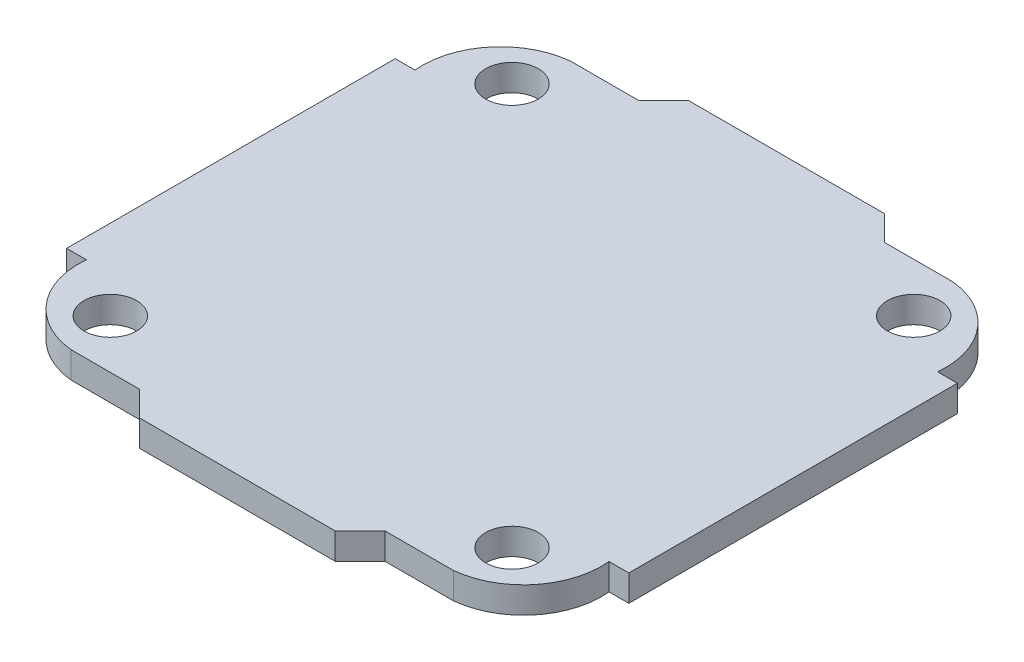
ISO-10303-21;
HEADER;
FILE_DESCRIPTION(('STEP AP214'),'2;1');
FILE_NAME('part.step','',(''),(''),'','','');
FILE_SCHEMA(('AUTOMOTIVE_DESIGN { 1 0 10303 214 1 1 1 1 }'));
ENDSEC;
DATA;
#1=APPLICATION_CONTEXT('core data for automotive mechanical design processes');
#2=APPLICATION_PROTOCOL_DEFINITION('international standard','automotive_design',2000,#1);
#3=PRODUCT_CONTEXT('',#1,'mechanical');
#4=PRODUCT('Part','Part','',(#3));
#5=PRODUCT_RELATED_PRODUCT_CATEGORY('part','',(#4));
#6=PRODUCT_DEFINITION_FORMATION('','',#4);
#7=PRODUCT_DEFINITION_CONTEXT('part definition',#1,'design');
#8=PRODUCT_DEFINITION('design','',#6,#7);
#9=PRODUCT_DEFINITION_SHAPE('','',#8);
#10=(LENGTH_UNIT() NAMED_UNIT(*) SI_UNIT(.MILLI.,.METRE.));
#11=(NAMED_UNIT(*) PLANE_ANGLE_UNIT() SI_UNIT($,.RADIAN.));
#12=(NAMED_UNIT(*) SI_UNIT($,.STERADIAN.) SOLID_ANGLE_UNIT());
#13=UNCERTAINTY_MEASURE_WITH_UNIT(LENGTH_MEASURE(1.E-05),#10,'distance_accuracy_value','');
#14=(GEOMETRIC_REPRESENTATION_CONTEXT(3) GLOBAL_UNCERTAINTY_ASSIGNED_CONTEXT((#13)) GLOBAL_UNIT_ASSIGNED_CONTEXT((#10,
#11,#12)) REPRESENTATION_CONTEXT('',''));
#15=CARTESIAN_POINT('',(0.,0.,0.));
#16=DIRECTION('',(0.,0.,1.));
#17=DIRECTION('',(1.,0.,0.));
#18=AXIS2_PLACEMENT_3D('',#15,#16,#17);
#19=CARTESIAN_POINT('',(0.,2.,0.));
#20=DIRECTION('',(0.,1.,0.));
#21=DIRECTION('',(0.,0.,1.));
#22=AXIS2_PLACEMENT_3D('',#19,#20,#21);
#23=PLANE('',#22);
#24=DIRECTION('',(-0.707106781186546,0.,-0.707106781186549));
#25=VECTOR('',#24,1.);
#26=CARTESIAN_POINT('',(-9.31312532764978,2.,18.9681853553326));
#27=LINE('',#26,#25);
#28=CARTESIAN_POINT('',(-7.42392500251573,2.,20.8573856804667));
#29=VERTEX_POINT('',#28);
#30=CARTESIAN_POINT('',(-9.31312532764978,2.,18.9681853553326));
#31=VERTEX_POINT('',#30);
#32=EDGE_CURVE('E332',#29,#31,#27,.T.);
#33=ORIENTED_EDGE('',*,*,#32,.F.);
#34=DIRECTION('',(1.,0.,0.));
#35=VECTOR('',#34,1.);
#36=CARTESIAN_POINT('',(-19.8872747185846,2.,20.8573856804667));
#37=LINE('',#36,#35);
#38=CARTESIAN_POINT('',(7.42392500251573,2.,20.8573856804667));
#39=VERTEX_POINT('',#38);
#40=EDGE_CURVE('E214',#29,#39,#37,.T.);
#41=ORIENTED_EDGE('',*,*,#40,.T.);
#42=DIRECTION('',(-0.707106781186546,0.,0.707106781186549));
#43=VECTOR('',#42,1.);
#44=CARTESIAN_POINT('',(9.31312532764978,2.,18.9681853553326));
#45=LINE('',#44,#43);
#46=CARTESIAN_POINT('',(9.31312532764978,2.,18.9681853553326));
#47=VERTEX_POINT('',#46);
#48=EDGE_CURVE('E380',#47,#39,#45,.T.);
#49=ORIENTED_EDGE('',*,*,#48,.F.);
#50=DIRECTION('',(-1.,0.,0.));
#51=VECTOR('',#50,1.);
#52=CARTESIAN_POINT('',(14.5122677443801,2.,18.9681853553326));
#53=LINE('',#52,#51);
#54=CARTESIAN_POINT('',(14.5122677443801,2.,18.9681853553326));
#55=VERTEX_POINT('',#54);
#56=EDGE_CURVE('E193',#55,#47,#53,.T.);
#57=ORIENTED_EDGE('',*,*,#56,.F.);
#58=CARTESIAN_POINT('',(13.9304142609193,2.,13.0558031846826));
#59=DIRECTION('',(0.,-1.,0.));
#60=DIRECTION('',(0.,0.,-1.));
#61=AXIS2_PLACEMENT_3D('',#58,#59,#60);
#62=CIRCLE('',#61,5.94094406706841);
#63=CARTESIAN_POINT('',(19.8427964315693,2.,12.4739497012219));
#64=VERTEX_POINT('',#63);
#65=EDGE_CURVE('E365',#64,#55,#62,.T.);
#66=ORIENTED_EDGE('',*,*,#65,.F.);
#67=DIRECTION('',(-1.,0.,0.));
#68=VECTOR('',#67,1.);
#69=CARTESIAN_POINT('',(19.8427964315693,2.,12.4739497012219));
#70=LINE('',#69,#68);
#71=CARTESIAN_POINT('',(21.3424411614078,2.,12.4739497012219));
#72=VERTEX_POINT('',#71);
#73=EDGE_CURVE('E383',#72,#64,#70,.T.);
#74=ORIENTED_EDGE('',*,*,#73,.F.);
#75=DIRECTION('',(0.,0.,-1.));
#76=VECTOR('',#75,1.);
#77=CARTESIAN_POINT('',(21.3424411614078,2.,19.4022192376435));
#78=LINE('',#77,#76);
#79=CARTESIAN_POINT('',(21.3424411614078,2.,-12.4739497012219));
#80=VERTEX_POINT('',#79);
#81=EDGE_CURVE('E210',#72,#80,#78,.T.);
#82=ORIENTED_EDGE('',*,*,#81,.T.);
#83=DIRECTION('',(1.,0.,0.));
#84=VECTOR('',#83,1.);
#85=CARTESIAN_POINT('',(19.8427964315693,2.,-12.4739497012219));
#86=LINE('',#85,#84);
#87=CARTESIAN_POINT('',(19.8427964315693,2.,-12.4739497012219));
#88=VERTEX_POINT('',#87);
#89=EDGE_CURVE('E406',#88,#80,#86,.T.);
#90=ORIENTED_EDGE('',*,*,#89,.F.);
#91=CARTESIAN_POINT('',(13.9304142609193,2.,-13.0558031846826));
#92=DIRECTION('',(0.,-1.,0.));
#93=DIRECTION('',(0.,0.,1.));
#94=AXIS2_PLACEMENT_3D('',#91,#92,#93);
#95=CIRCLE('',#94,5.94094406706841);
#96=CARTESIAN_POINT('',(14.5122677443801,2.,-18.9681853553326));
#97=VERTEX_POINT('',#96);
#98=EDGE_CURVE('E422',#97,#88,#95,.T.);
#99=ORIENTED_EDGE('',*,*,#98,.F.);
#100=DIRECTION('',(1.,0.,0.));
#101=VECTOR('',#100,1.);
#102=CARTESIAN_POINT('',(14.5122677443801,2.,-18.9681853553326));
#103=LINE('',#102,#101);
#104=CARTESIAN_POINT('',(9.31312532764978,2.,-18.9681853553326));
#105=VERTEX_POINT('',#104);
#106=EDGE_CURVE('E202',#105,#97,#103,.T.);
#107=ORIENTED_EDGE('',*,*,#106,.F.);
#108=DIRECTION('',(0.707106781186546,0.,0.707106781186549));
#109=VECTOR('',#108,1.);
#110=CARTESIAN_POINT('',(9.31312532764978,2.,-18.9681853553326));
#111=LINE('',#110,#109);
#112=CARTESIAN_POINT('',(7.42392500251573,2.,-20.8573856804667));
#113=VERTEX_POINT('',#112);
#114=EDGE_CURVE('E185',#113,#105,#111,.T.);
#115=ORIENTED_EDGE('',*,*,#114,.F.);
#116=DIRECTION('',(-1.,0.,0.));
#117=VECTOR('',#116,1.);
#118=CARTESIAN_POINT('',(19.8872747185845,2.,-20.8573856804667));
#119=LINE('',#118,#117);
#120=CARTESIAN_POINT('',(-7.42392500251573,2.,-20.8573856804667));
#121=VERTEX_POINT('',#120);
#122=EDGE_CURVE('E54',#113,#121,#119,.T.);
#123=ORIENTED_EDGE('',*,*,#122,.T.);
#124=DIRECTION('',(0.707106781186546,0.,-0.707106781186549));
#125=VECTOR('',#124,1.);
#126=CARTESIAN_POINT('',(-9.31312532764978,2.,-18.9681853553326));
#127=LINE('',#126,#125);
#128=CARTESIAN_POINT('',(-9.31312532764978,2.,-18.9681853553326));
#129=VERTEX_POINT('',#128);
#130=EDGE_CURVE('E290',#129,#121,#127,.T.);
#131=ORIENTED_EDGE('',*,*,#130,.F.);
#132=DIRECTION('',(1.,0.,0.));
#133=VECTOR('',#132,1.);
#134=CARTESIAN_POINT('',(-14.5122677443801,2.,-18.9681853553326));
#135=LINE('',#134,#133);
#136=CARTESIAN_POINT('',(-14.5122677443801,2.,-18.9681853553326));
#137=VERTEX_POINT('',#136);
#138=EDGE_CURVE('E293',#137,#129,#135,.T.);
#139=ORIENTED_EDGE('',*,*,#138,.F.);
#140=CARTESIAN_POINT('',(-13.9304142609193,2.,-13.0558031846826));
#141=DIRECTION('',(0.,-1.,0.));
#142=DIRECTION('',(0.,0.,-1.));
#143=AXIS2_PLACEMENT_3D('',#140,#141,#142);
#144=CIRCLE('',#143,5.94094406706841);
#145=CARTESIAN_POINT('',(-19.8427964315693,2.,-12.4739497012219));
#146=VERTEX_POINT('',#145);
#147=EDGE_CURVE('E204',#146,#137,#144,.T.);
#148=ORIENTED_EDGE('',*,*,#147,.F.);
#149=DIRECTION('',(1.,0.,0.));
#150=VECTOR('',#149,1.);
#151=CARTESIAN_POINT('',(-19.8427964315693,2.,-12.4739497012219));
#152=LINE('',#151,#150);
#153=CARTESIAN_POINT('',(-21.3424411614078,2.,-12.4739497012219));
#154=VERTEX_POINT('',#153);
#155=EDGE_CURVE('E285',#154,#146,#152,.T.);
#156=ORIENTED_EDGE('',*,*,#155,.F.);
#157=DIRECTION('',(0.,0.,1.));
#158=VECTOR('',#157,1.);
#159=CARTESIAN_POINT('',(-21.3424411614078,2.,-19.4022192376435));
#160=LINE('',#159,#158);
#161=CARTESIAN_POINT('',(-21.3424411614078,2.,12.4739497012219));
#162=VERTEX_POINT('',#161);
#163=EDGE_CURVE('E11',#154,#162,#160,.T.);
#164=ORIENTED_EDGE('',*,*,#163,.T.);
#165=DIRECTION('',(-1.,0.,0.));
#166=VECTOR('',#165,1.);
#167=CARTESIAN_POINT('',(-19.8427964315693,2.,12.4739497012219));
#168=LINE('',#167,#166);
#169=CARTESIAN_POINT('',(-19.8427964315693,2.,12.4739497012219));
#170=VERTEX_POINT('',#169);
#171=EDGE_CURVE('E318',#170,#162,#168,.T.);
#172=ORIENTED_EDGE('',*,*,#171,.F.);
#173=CARTESIAN_POINT('',(-13.9304142609193,2.,13.0558031846826));
#174=DIRECTION('',(0.,-1.,0.));
#175=DIRECTION('',(0.,0.,1.));
#176=AXIS2_PLACEMENT_3D('',#173,#174,#175);
#177=CIRCLE('',#176,5.94094406706841);
#178=CARTESIAN_POINT('',(-14.5122677443801,2.,18.9681853553326));
#179=VERTEX_POINT('',#178);
#180=EDGE_CURVE('E341',#179,#170,#177,.T.);
#181=ORIENTED_EDGE('',*,*,#180,.F.);
#182=DIRECTION('',(-1.,0.,0.));
#183=VECTOR('',#182,1.);
#184=CARTESIAN_POINT('',(-14.5122677443801,2.,18.9681853553326));
#185=LINE('',#184,#183);
#186=EDGE_CURVE('E337',#31,#179,#185,.T.);
#187=ORIENTED_EDGE('',*,*,#186,.F.);
#188=EDGE_LOOP('',(#33,#41,#49,#57,#66,#74,#82,#90,#99,#107,#115,#123,#131,#139,#148,#156,#164,
#172,#181,#187));
#189=FACE_BOUND('',#188,.T.);
#190=CARTESIAN_POINT('',(15.25,2.,15.25));
#191=DIRECTION('',(0.,1.,0.));
#192=DIRECTION('',(0.,0.,-1.));
#193=AXIS2_PLACEMENT_3D('',#190,#191,#192);
#194=CIRCLE('',#193,2.);
#195=CARTESIAN_POINT('',(15.25,2.,13.25));
#196=VERTEX_POINT('',#195);
#197=EDGE_CURVE('E251',#196,#196,#194,.T.);
#198=ORIENTED_EDGE('',*,*,#197,.F.);
#199=EDGE_LOOP('',(#198));
#200=FACE_BOUND('',#199,.T.);
#201=CARTESIAN_POINT('',(15.25,2.,-15.25));
#202=DIRECTION('',(0.,1.,0.));
#203=DIRECTION('',(0.,0.,1.));
#204=AXIS2_PLACEMENT_3D('',#201,#202,#203);
#205=CIRCLE('',#204,2.);
#206=CARTESIAN_POINT('',(15.25,2.,-13.25));
#207=VERTEX_POINT('',#206);
#208=EDGE_CURVE('E223',#207,#207,#205,.T.);
#209=ORIENTED_EDGE('',*,*,#208,.F.);
#210=EDGE_LOOP('',(#209));
#211=FACE_BOUND('',#210,.T.);
#212=CARTESIAN_POINT('',(-15.25,2.,-15.25));
#213=DIRECTION('',(0.,1.,0.));
#214=DIRECTION('',(0.,0.,-1.));
#215=AXIS2_PLACEMENT_3D('',#212,#213,#214);
#216=CIRCLE('',#215,2.);
#217=CARTESIAN_POINT('',(-15.25,2.,-17.25));
#218=VERTEX_POINT('',#217);
#219=EDGE_CURVE('E243',#218,#218,#216,.T.);
#220=ORIENTED_EDGE('',*,*,#219,.F.);
#221=EDGE_LOOP('',(#220));
#222=FACE_BOUND('',#221,.T.);
#223=CARTESIAN_POINT('',(-15.25,2.,15.25));
#224=DIRECTION('',(0.,1.,0.));
#225=DIRECTION('',(0.,0.,1.));
#226=AXIS2_PLACEMENT_3D('',#223,#224,#225);
#227=CIRCLE('',#226,2.);
#228=CARTESIAN_POINT('',(-15.25,2.,17.25));
#229=VERTEX_POINT('',#228);
#230=EDGE_CURVE('E259',#229,#229,#227,.T.);
#231=ORIENTED_EDGE('',*,*,#230,.F.);
#232=EDGE_LOOP('',(#231));
#233=FACE_BOUND('',#232,.T.);
#234=ADVANCED_FACE('F44',(#189,#200,#211,#222,#233),#23,.T.);
#235=CARTESIAN_POINT('',(0.,0.,0.));
#236=DIRECTION('',(0.,1.,0.));
#237=DIRECTION('',(0.,0.,1.));
#238=AXIS2_PLACEMENT_3D('',#235,#236,#237);
#239=PLANE('',#238);
#240=DIRECTION('',(1.,0.,0.));
#241=VECTOR('',#240,1.);
#242=CARTESIAN_POINT('',(-19.8872747185846,0.,20.8573856804667));
#243=LINE('',#242,#241);
#244=CARTESIAN_POINT('',(-7.42392500251573,0.,20.8573856804667));
#245=VERTEX_POINT('',#244);
#246=CARTESIAN_POINT('',(7.42392500251573,0.,20.8573856804667));
#247=VERTEX_POINT('',#246);
#248=EDGE_CURVE('E218',#245,#247,#243,.T.);
#249=ORIENTED_EDGE('',*,*,#248,.F.);
#250=DIRECTION('',(-0.707106781186546,0.,-0.707106781186549));
#251=VECTOR('',#250,1.);
#252=CARTESIAN_POINT('',(-9.31312532764978,0.,18.9681853553326));
#253=LINE('',#252,#251);
#254=CARTESIAN_POINT('',(-9.31312532764978,0.,18.9681853553326));
#255=VERTEX_POINT('',#254);
#256=EDGE_CURVE('E314',#245,#255,#253,.T.);
#257=ORIENTED_EDGE('',*,*,#256,.T.);
#258=DIRECTION('',(-1.,0.,0.));
#259=VECTOR('',#258,1.);
#260=CARTESIAN_POINT('',(-14.5122677443801,0.,18.9681853553326));
#261=LINE('',#260,#259);
#262=CARTESIAN_POINT('',(-14.5122677443801,0.,18.9681853553326));
#263=VERTEX_POINT('',#262);
#264=EDGE_CURVE('E319',#255,#263,#261,.T.);
#265=ORIENTED_EDGE('',*,*,#264,.T.);
#266=CARTESIAN_POINT('',(-13.9304142609193,0.,13.0558031846826));
#267=DIRECTION('',(0.,-1.,0.));
#268=DIRECTION('',(0.,0.,1.));
#269=AXIS2_PLACEMENT_3D('',#266,#267,#268);
#270=CIRCLE('',#269,5.94094406706841);
#271=CARTESIAN_POINT('',(-19.8427964315693,0.,12.4739497012219));
#272=VERTEX_POINT('',#271);
#273=EDGE_CURVE('E323',#263,#272,#270,.T.);
#274=ORIENTED_EDGE('',*,*,#273,.T.);
#275=DIRECTION('',(-1.,0.,0.));
#276=VECTOR('',#275,1.);
#277=CARTESIAN_POINT('',(-19.8427964315693,0.,12.4739497012219));
#278=LINE('',#277,#276);
#279=CARTESIAN_POINT('',(-21.3424411614078,0.,12.4739497012219));
#280=VERTEX_POINT('',#279);
#281=EDGE_CURVE('E327',#272,#280,#278,.T.);
#282=ORIENTED_EDGE('',*,*,#281,.T.);
#283=DIRECTION('',(0.,0.,1.));
#284=VECTOR('',#283,1.);
#285=CARTESIAN_POINT('',(-21.3424411614078,0.,-19.4022192376435));
#286=LINE('',#285,#284);
#287=CARTESIAN_POINT('',(-21.3424411614078,0.,-12.4739497012219));
#288=VERTEX_POINT('',#287);
#289=EDGE_CURVE('E48',#288,#280,#286,.T.);
#290=ORIENTED_EDGE('',*,*,#289,.F.);
#291=DIRECTION('',(1.,0.,0.));
#292=VECTOR('',#291,1.);
#293=CARTESIAN_POINT('',(-19.8427964315693,0.,-12.4739497012219));
#294=LINE('',#293,#292);
#295=CARTESIAN_POINT('',(-19.8427964315693,0.,-12.4739497012219));
#296=VERTEX_POINT('',#295);
#297=EDGE_CURVE('E275',#288,#296,#294,.T.);
#298=ORIENTED_EDGE('',*,*,#297,.T.);
#299=CARTESIAN_POINT('',(-13.9304142609193,0.,-13.0558031846826));
#300=DIRECTION('',(0.,-1.,0.));
#301=DIRECTION('',(0.,0.,-1.));
#302=AXIS2_PLACEMENT_3D('',#299,#300,#301);
#303=CIRCLE('',#302,5.94094406706841);
#304=CARTESIAN_POINT('',(-14.5122677443801,0.,-18.9681853553326));
#305=VERTEX_POINT('',#304);
#306=EDGE_CURVE('E289',#296,#305,#303,.T.);
#307=ORIENTED_EDGE('',*,*,#306,.T.);
#308=DIRECTION('',(1.,0.,0.));
#309=VECTOR('',#308,1.);
#310=CARTESIAN_POINT('',(-14.5122677443801,0.,-18.9681853553326));
#311=LINE('',#310,#309);
#312=CARTESIAN_POINT('',(-9.31312532764978,0.,-18.9681853553326));
#313=VERTEX_POINT('',#312);
#314=EDGE_CURVE('E307',#305,#313,#311,.T.);
#315=ORIENTED_EDGE('',*,*,#314,.T.);
#316=DIRECTION('',(0.707106781186546,0.,-0.707106781186549));
#317=VECTOR('',#316,1.);
#318=CARTESIAN_POINT('',(-9.31312532764978,0.,-18.9681853553326));
#319=LINE('',#318,#317);
#320=CARTESIAN_POINT('',(-7.42392500251573,0.,-20.8573856804667));
#321=VERTEX_POINT('',#320);
#322=EDGE_CURVE('E303',#313,#321,#319,.T.);
#323=ORIENTED_EDGE('',*,*,#322,.T.);
#324=DIRECTION('',(-1.,0.,0.));
#325=VECTOR('',#324,1.);
#326=CARTESIAN_POINT('',(19.8872747185845,0.,-20.8573856804667));
#327=LINE('',#326,#325);
#328=CARTESIAN_POINT('',(7.42392500251573,0.,-20.8573856804667));
#329=VERTEX_POINT('',#328);
#330=EDGE_CURVE('E226',#329,#321,#327,.T.);
#331=ORIENTED_EDGE('',*,*,#330,.F.);
#332=DIRECTION('',(0.707106781186546,0.,0.707106781186549));
#333=VECTOR('',#332,1.);
#334=CARTESIAN_POINT('',(9.31312532764978,0.,-18.9681853553326));
#335=LINE('',#334,#333);
#336=CARTESIAN_POINT('',(9.31312532764978,0.,-18.9681853553326));
#337=VERTEX_POINT('',#336);
#338=EDGE_CURVE('E70',#329,#337,#335,.T.);
#339=ORIENTED_EDGE('',*,*,#338,.T.);
#340=DIRECTION('',(1.,0.,0.));
#341=VECTOR('',#340,1.);
#342=CARTESIAN_POINT('',(14.5122677443801,0.,-18.9681853553326));
#343=LINE('',#342,#341);
#344=CARTESIAN_POINT('',(14.5122677443801,0.,-18.9681853553326));
#345=VERTEX_POINT('',#344);
#346=EDGE_CURVE('E407',#337,#345,#343,.T.);
#347=ORIENTED_EDGE('',*,*,#346,.T.);
#348=CARTESIAN_POINT('',(13.9304142609193,0.,-13.0558031846826));
#349=DIRECTION('',(0.,-1.,0.));
#350=DIRECTION('',(0.,0.,1.));
#351=AXIS2_PLACEMENT_3D('',#348,#349,#350);
#352=CIRCLE('',#351,5.94094406706841);
#353=CARTESIAN_POINT('',(19.8427964315693,0.,-12.4739497012219));
#354=VERTEX_POINT('',#353);
#355=EDGE_CURVE('E411',#345,#354,#352,.T.);
#356=ORIENTED_EDGE('',*,*,#355,.T.);
#357=DIRECTION('',(1.,0.,0.));
#358=VECTOR('',#357,1.);
#359=CARTESIAN_POINT('',(19.8427964315693,0.,-12.4739497012219));
#360=LINE('',#359,#358);
#361=CARTESIAN_POINT('',(21.3424411614078,0.,-12.4739497012219));
#362=VERTEX_POINT('',#361);
#363=EDGE_CURVE('E415',#354,#362,#360,.T.);
#364=ORIENTED_EDGE('',*,*,#363,.T.);
#365=DIRECTION('',(0.,0.,-1.));
#366=VECTOR('',#365,1.);
#367=CARTESIAN_POINT('',(21.3424411614078,0.,19.4022192376435));
#368=LINE('',#367,#366);
#369=CARTESIAN_POINT('',(21.3424411614078,0.,12.4739497012219));
#370=VERTEX_POINT('',#369);
#371=EDGE_CURVE('E222',#370,#362,#368,.T.);
#372=ORIENTED_EDGE('',*,*,#371,.F.);
#373=DIRECTION('',(-1.,0.,0.));
#374=VECTOR('',#373,1.);
#375=CARTESIAN_POINT('',(19.8427964315693,0.,12.4739497012219));
#376=LINE('',#375,#374);
#377=CARTESIAN_POINT('',(19.8427964315693,0.,12.4739497012219));
#378=VERTEX_POINT('',#377);
#379=EDGE_CURVE('E62',#370,#378,#376,.T.);
#380=ORIENTED_EDGE('',*,*,#379,.T.);
#381=CARTESIAN_POINT('',(13.9304142609193,0.,13.0558031846826));
#382=DIRECTION('',(0.,-1.,0.));
#383=DIRECTION('',(0.,0.,-1.));
#384=AXIS2_PLACEMENT_3D('',#381,#382,#383);
#385=CIRCLE('',#384,5.94094406706841);
#386=CARTESIAN_POINT('',(14.5122677443801,0.,18.9681853553326));
#387=VERTEX_POINT('',#386);
#388=EDGE_CURVE('E372',#378,#387,#385,.T.);
#389=ORIENTED_EDGE('',*,*,#388,.T.);
#390=DIRECTION('',(-1.,0.,0.));
#391=VECTOR('',#390,1.);
#392=CARTESIAN_POINT('',(14.5122677443801,0.,18.9681853553326));
#393=LINE('',#392,#391);
#394=CARTESIAN_POINT('',(9.31312532764978,0.,18.9681853553326));
#395=VERTEX_POINT('',#394);
#396=EDGE_CURVE('E361',#387,#395,#393,.T.);
#397=ORIENTED_EDGE('',*,*,#396,.T.);
#398=DIRECTION('',(-0.707106781186546,0.,0.707106781186549));
#399=VECTOR('',#398,1.);
#400=CARTESIAN_POINT('',(9.31312532764978,0.,18.9681853553326));
#401=LINE('',#400,#399);
#402=EDGE_CURVE('E366',#395,#247,#401,.T.);
#403=ORIENTED_EDGE('',*,*,#402,.T.);
#404=EDGE_LOOP('',(#249,#257,#265,#274,#282,#290,#298,#307,#315,#323,#331,#339,#347,#356,#364,
#372,#380,#389,#397,#403));
#405=FACE_BOUND('',#404,.T.);
#406=CARTESIAN_POINT('',(15.25,0.,-15.25));
#407=DIRECTION('',(0.,1.,0.));
#408=DIRECTION('',(0.,0.,1.));
#409=AXIS2_PLACEMENT_3D('',#406,#407,#408);
#410=CIRCLE('',#409,2.);
#411=CARTESIAN_POINT('',(15.25,0.,-13.25));
#412=VERTEX_POINT('',#411);
#413=EDGE_CURVE('E239',#412,#412,#410,.T.);
#414=ORIENTED_EDGE('',*,*,#413,.T.);
#415=EDGE_LOOP('',(#414));
#416=FACE_BOUND('',#415,.T.);
#417=CARTESIAN_POINT('',(-15.25,0.,-15.25));
#418=DIRECTION('',(0.,1.,0.));
#419=DIRECTION('',(0.,0.,-1.));
#420=AXIS2_PLACEMENT_3D('',#417,#418,#419);
#421=CIRCLE('',#420,2.);
#422=CARTESIAN_POINT('',(-15.25,0.,-17.25));
#423=VERTEX_POINT('',#422);
#424=EDGE_CURVE('E247',#423,#423,#421,.T.);
#425=ORIENTED_EDGE('',*,*,#424,.T.);
#426=EDGE_LOOP('',(#425));
#427=FACE_BOUND('',#426,.T.);
#428=CARTESIAN_POINT('',(15.25,0.,15.25));
#429=DIRECTION('',(0.,1.,0.));
#430=DIRECTION('',(0.,0.,-1.));
#431=AXIS2_PLACEMENT_3D('',#428,#429,#430);
#432=CIRCLE('',#431,2.);
#433=CARTESIAN_POINT('',(15.25,0.,13.25));
#434=VERTEX_POINT('',#433);
#435=EDGE_CURVE('E255',#434,#434,#432,.T.);
#436=ORIENTED_EDGE('',*,*,#435,.T.);
#437=EDGE_LOOP('',(#436));
#438=FACE_BOUND('',#437,.T.);
#439=CARTESIAN_POINT('',(-15.25,0.,15.25));
#440=DIRECTION('',(0.,1.,0.));
#441=DIRECTION('',(0.,0.,1.));
#442=AXIS2_PLACEMENT_3D('',#439,#440,#441);
#443=CIRCLE('',#442,2.);
#444=CARTESIAN_POINT('',(-15.25,0.,17.25));
#445=VERTEX_POINT('',#444);
#446=EDGE_CURVE('E263',#445,#445,#443,.T.);
#447=ORIENTED_EDGE('',*,*,#446,.T.);
#448=EDGE_LOOP('',(#447));
#449=FACE_BOUND('',#448,.T.);
#450=ADVANCED_FACE('F444',(#405,#416,#427,#438,#449),#239,.F.);
#451=CARTESIAN_POINT('',(-19.8872747185846,2.,20.8573856804667));
#452=DIRECTION('',(0.,0.,-1.));
#453=DIRECTION('',(-1.,0.,0.));
#454=AXIS2_PLACEMENT_3D('',#451,#452,#453);
#455=PLANE('',#454);
#456=ORIENTED_EDGE('',*,*,#40,.F.);
#457=DIRECTION('',(0.,1.,0.));
#458=VECTOR('',#457,1.);
#459=CARTESIAN_POINT('',(-7.42392500251573,0.,20.8573856804667));
#460=LINE('',#459,#458);
#461=EDGE_CURVE('E347',#245,#29,#460,.T.);
#462=ORIENTED_EDGE('',*,*,#461,.F.);
#463=ORIENTED_EDGE('',*,*,#248,.T.);
#464=DIRECTION('',(0.,1.,0.));
#465=VECTOR('',#464,1.);
#466=CARTESIAN_POINT('',(7.42392500251573,0.,20.8573856804667));
#467=LINE('',#466,#465);
#468=EDGE_CURVE('E398',#247,#39,#467,.T.);
#469=ORIENTED_EDGE('',*,*,#468,.T.);
#470=EDGE_LOOP('',(#456,#462,#463,#469));
#471=FACE_BOUND('',#470,.T.);
#472=ADVANCED_FACE('F46',(#471),#455,.F.);
#473=CARTESIAN_POINT('',(21.3424411614078,2.,19.4022192376435));
#474=DIRECTION('',(-1.,0.,0.));
#475=DIRECTION('',(0.,0.,1.));
#476=AXIS2_PLACEMENT_3D('',#473,#474,#475);
#477=PLANE('',#476);
#478=ORIENTED_EDGE('',*,*,#81,.F.);
#479=DIRECTION('',(0.,1.,0.));
#480=VECTOR('',#479,1.);
#481=CARTESIAN_POINT('',(21.3424411614078,0.,12.4739497012219));
#482=LINE('',#481,#480);
#483=EDGE_CURVE('E395',#370,#72,#482,.T.);
#484=ORIENTED_EDGE('',*,*,#483,.F.);
#485=ORIENTED_EDGE('',*,*,#371,.T.);
#486=DIRECTION('',(0.,1.,0.));
#487=VECTOR('',#486,1.);
#488=CARTESIAN_POINT('',(21.3424411614078,0.,-12.4739497012219));
#489=LINE('',#488,#487);
#490=EDGE_CURVE('E192',#362,#80,#489,.T.);
#491=ORIENTED_EDGE('',*,*,#490,.T.);
#492=EDGE_LOOP('',(#478,#484,#485,#491));
#493=FACE_BOUND('',#492,.T.);
#494=ADVANCED_FACE('F494',(#493),#477,.F.);
#495=CARTESIAN_POINT('',(19.8872747185845,2.,-20.8573856804667));
#496=DIRECTION('',(0.,0.,1.));
#497=DIRECTION('',(1.,0.,0.));
#498=AXIS2_PLACEMENT_3D('',#495,#496,#497);
#499=PLANE('',#498);
#500=ORIENTED_EDGE('',*,*,#122,.F.);
#501=DIRECTION('',(0.,1.,0.));
#502=VECTOR('',#501,1.);
#503=CARTESIAN_POINT('',(7.42392500251573,0.,-20.8573856804667));
#504=LINE('',#503,#502);
#505=EDGE_CURVE('E182',#329,#113,#504,.T.);
#506=ORIENTED_EDGE('',*,*,#505,.F.);
#507=ORIENTED_EDGE('',*,*,#330,.T.);
#508=DIRECTION('',(0.,1.,0.));
#509=VECTOR('',#508,1.);
#510=CARTESIAN_POINT('',(-7.42392500251573,0.,-20.8573856804667));
#511=LINE('',#510,#509);
#512=EDGE_CURVE('E208',#321,#121,#511,.T.);
#513=ORIENTED_EDGE('',*,*,#512,.T.);
#514=EDGE_LOOP('',(#500,#506,#507,#513));
#515=FACE_BOUND('',#514,.T.);
#516=ADVANCED_FACE('F207',(#515),#499,.F.);
#517=CARTESIAN_POINT('',(-21.3424411614078,2.,-19.4022192376435));
#518=DIRECTION('',(1.,0.,0.));
#519=DIRECTION('',(0.,0.,-1.));
#520=AXIS2_PLACEMENT_3D('',#517,#518,#519);
#521=PLANE('',#520);
#522=ORIENTED_EDGE('',*,*,#289,.T.);
#523=DIRECTION('',(0.,1.,0.));
#524=VECTOR('',#523,1.);
#525=CARTESIAN_POINT('',(-21.3424411614078,0.,12.4739497012219));
#526=LINE('',#525,#524);
#527=EDGE_CURVE('E350',#280,#162,#526,.T.);
#528=ORIENTED_EDGE('',*,*,#527,.T.);
#529=ORIENTED_EDGE('',*,*,#163,.F.);
#530=DIRECTION('',(0.,1.,0.));
#531=VECTOR('',#530,1.);
#532=CARTESIAN_POINT('',(-21.3424411614078,0.,-12.4739497012219));
#533=LINE('',#532,#531);
#534=EDGE_CURVE('E280',#288,#154,#533,.T.);
#535=ORIENTED_EDGE('',*,*,#534,.F.);
#536=EDGE_LOOP('',(#522,#528,#529,#535));
#537=FACE_BOUND('',#536,.T.);
#538=ADVANCED_FACE('F462',(#537),#521,.F.);
#539=CARTESIAN_POINT('',(15.25,2.,-15.25));
#540=DIRECTION('',(0.,-1.,0.));
#541=DIRECTION('',(0.,0.,-1.));
#542=AXIS2_PLACEMENT_3D('',#539,#540,#541);
#543=CYLINDRICAL_SURFACE('',#542,2.);
#544=ORIENTED_EDGE('',*,*,#208,.T.);
#545=EDGE_LOOP('',(#544));
#546=FACE_BOUND('',#545,.T.);
#547=ORIENTED_EDGE('',*,*,#413,.F.);
#548=EDGE_LOOP('',(#547));
#549=FACE_BOUND('',#548,.T.);
#550=ADVANCED_FACE('F517',(#546,#549),#543,.F.);
#551=CARTESIAN_POINT('',(-15.25,2.,-15.25));
#552=DIRECTION('',(0.,-1.,0.));
#553=DIRECTION('',(0.,0.,-1.));
#554=AXIS2_PLACEMENT_3D('',#551,#552,#553);
#555=CYLINDRICAL_SURFACE('',#554,2.);
#556=ORIENTED_EDGE('',*,*,#219,.T.);
#557=EDGE_LOOP('',(#556));
#558=FACE_BOUND('',#557,.T.);
#559=ORIENTED_EDGE('',*,*,#424,.F.);
#560=EDGE_LOOP('',(#559));
#561=FACE_BOUND('',#560,.T.);
#562=ADVANCED_FACE('F562',(#558,#561),#555,.F.);
#563=CARTESIAN_POINT('',(15.25,2.,15.25));
#564=DIRECTION('',(0.,-1.,0.));
#565=DIRECTION('',(0.,0.,-1.));
#566=AXIS2_PLACEMENT_3D('',#563,#564,#565);
#567=CYLINDRICAL_SURFACE('',#566,2.);
#568=ORIENTED_EDGE('',*,*,#197,.T.);
#569=EDGE_LOOP('',(#568));
#570=FACE_BOUND('',#569,.T.);
#571=ORIENTED_EDGE('',*,*,#435,.F.);
#572=EDGE_LOOP('',(#571));
#573=FACE_BOUND('',#572,.T.);
#574=ADVANCED_FACE('F570',(#570,#573),#567,.F.);
#575=CARTESIAN_POINT('',(-15.25,2.,15.25));
#576=DIRECTION('',(0.,-1.,0.));
#577=DIRECTION('',(0.,0.,-1.));
#578=AXIS2_PLACEMENT_3D('',#575,#576,#577);
#579=CYLINDRICAL_SURFACE('',#578,2.);
#580=ORIENTED_EDGE('',*,*,#230,.T.);
#581=EDGE_LOOP('',(#580));
#582=FACE_BOUND('',#581,.T.);
#583=ORIENTED_EDGE('',*,*,#446,.F.);
#584=EDGE_LOOP('',(#583));
#585=FACE_BOUND('',#584,.T.);
#586=ADVANCED_FACE('F578',(#582,#585),#579,.F.);
#587=CARTESIAN_POINT('',(-13.9304142609193,0.,-13.0558031846826));
#588=DIRECTION('',(0.,1.,0.));
#589=DIRECTION('',(0.,0.,1.));
#590=AXIS2_PLACEMENT_3D('',#587,#588,#589);
#591=CYLINDRICAL_SURFACE('',#590,5.94094406706841);
#592=ORIENTED_EDGE('',*,*,#147,.T.);
#593=DIRECTION('',(0.,1.,0.));
#594=VECTOR('',#593,1.);
#595=CARTESIAN_POINT('',(-14.5122677443801,0.,-18.9681853553326));
#596=LINE('',#595,#594);
#597=EDGE_CURVE('E271',#305,#137,#596,.T.);
#598=ORIENTED_EDGE('',*,*,#597,.F.);
#599=ORIENTED_EDGE('',*,*,#306,.F.);
#600=DIRECTION('',(0.,1.,0.));
#601=VECTOR('',#600,1.);
#602=CARTESIAN_POINT('',(-19.8427964315693,0.,-12.4739497012219));
#603=LINE('',#602,#601);
#604=EDGE_CURVE('E267',#296,#146,#603,.T.);
#605=ORIENTED_EDGE('',*,*,#604,.T.);
#606=EDGE_LOOP('',(#592,#598,#599,#605));
#607=FACE_BOUND('',#606,.T.);
#608=ADVANCED_FACE('F457',(#607),#591,.T.);
#609=CARTESIAN_POINT('',(-19.8427964315693,0.,-12.4739497012219));
#610=DIRECTION('',(0.,0.,1.));
#611=DIRECTION('',(1.,0.,0.));
#612=AXIS2_PLACEMENT_3D('',#609,#610,#611);
#613=PLANE('',#612);
#614=ORIENTED_EDGE('',*,*,#155,.T.);
#615=ORIENTED_EDGE('',*,*,#604,.F.);
#616=ORIENTED_EDGE('',*,*,#297,.F.);
#617=ORIENTED_EDGE('',*,*,#534,.T.);
#618=EDGE_LOOP('',(#614,#615,#616,#617));
#619=FACE_BOUND('',#618,.T.);
#620=ADVANCED_FACE('F459',(#619),#613,.F.);
#621=CARTESIAN_POINT('',(-9.31312532764978,0.,-18.9681853553326));
#622=DIRECTION('',(0.707106781186549,0.,0.707106781186546));
#623=DIRECTION('',(0.707106781186546,0.,-0.707106781186549));
#624=AXIS2_PLACEMENT_3D('',#621,#622,#623);
#625=PLANE('',#624);
#626=ORIENTED_EDGE('',*,*,#130,.T.);
#627=ORIENTED_EDGE('',*,*,#512,.F.);
#628=ORIENTED_EDGE('',*,*,#322,.F.);
#629=DIRECTION('',(0.,1.,0.));
#630=VECTOR('',#629,1.);
#631=CARTESIAN_POINT('',(-9.31312532764978,0.,-18.9681853553326));
#632=LINE('',#631,#630);
#633=EDGE_CURVE('E274',#313,#129,#632,.T.);
#634=ORIENTED_EDGE('',*,*,#633,.T.);
#635=EDGE_LOOP('',(#626,#627,#628,#634));
#636=FACE_BOUND('',#635,.T.);
#637=ADVANCED_FACE('F449',(#636),#625,.F.);
#638=CARTESIAN_POINT('',(-14.5122677443801,0.,-18.9681853553326));
#639=DIRECTION('',(0.,0.,1.));
#640=DIRECTION('',(1.,0.,0.));
#641=AXIS2_PLACEMENT_3D('',#638,#639,#640);
#642=PLANE('',#641);
#643=ORIENTED_EDGE('',*,*,#138,.T.);
#644=ORIENTED_EDGE('',*,*,#633,.F.);
#645=ORIENTED_EDGE('',*,*,#314,.F.);
#646=ORIENTED_EDGE('',*,*,#597,.T.);
#647=EDGE_LOOP('',(#643,#644,#645,#646));
#648=FACE_BOUND('',#647,.T.);
#649=ADVANCED_FACE('F454',(#648),#642,.F.);
#650=CARTESIAN_POINT('',(-9.31312532764978,0.,18.9681853553326));
#651=DIRECTION('',(0.707106781186549,0.,-0.707106781186546));
#652=DIRECTION('',(-0.707106781186546,0.,-0.707106781186549));
#653=AXIS2_PLACEMENT_3D('',#650,#651,#652);
#654=PLANE('',#653);
#655=ORIENTED_EDGE('',*,*,#32,.T.);
#656=DIRECTION('',(0.,1.,0.));
#657=VECTOR('',#656,1.);
#658=CARTESIAN_POINT('',(-9.31312532764978,0.,18.9681853553326));
#659=LINE('',#658,#657);
#660=EDGE_CURVE('E331',#255,#31,#659,.T.);
#661=ORIENTED_EDGE('',*,*,#660,.F.);
#662=ORIENTED_EDGE('',*,*,#256,.F.);
#663=ORIENTED_EDGE('',*,*,#461,.T.);
#664=EDGE_LOOP('',(#655,#661,#662,#663));
#665=FACE_BOUND('',#664,.T.);
#666=ADVANCED_FACE('F475',(#665),#654,.F.);
#667=CARTESIAN_POINT('',(-19.8427964315693,0.,12.4739497012219));
#668=DIRECTION('',(0.,0.,-1.));
#669=DIRECTION('',(-1.,0.,0.));
#670=AXIS2_PLACEMENT_3D('',#667,#668,#669);
#671=PLANE('',#670);
#672=ORIENTED_EDGE('',*,*,#171,.T.);
#673=ORIENTED_EDGE('',*,*,#527,.F.);
#674=ORIENTED_EDGE('',*,*,#281,.F.);
#675=DIRECTION('',(0.,1.,0.));
#676=VECTOR('',#675,1.);
#677=CARTESIAN_POINT('',(-19.8427964315693,0.,12.4739497012219));
#678=LINE('',#677,#676);
#679=EDGE_CURVE('E353',#272,#170,#678,.T.);
#680=ORIENTED_EDGE('',*,*,#679,.T.);
#681=EDGE_LOOP('',(#672,#673,#674,#680));
#682=FACE_BOUND('',#681,.T.);
#683=ADVANCED_FACE('F465',(#682),#671,.F.);
#684=CARTESIAN_POINT('',(-13.9304142609193,0.,13.0558031846826));
#685=DIRECTION('',(0.,1.,0.));
#686=DIRECTION('',(0.,0.,1.));
#687=AXIS2_PLACEMENT_3D('',#684,#685,#686);
#688=CYLINDRICAL_SURFACE('',#687,5.94094406706841);
#689=ORIENTED_EDGE('',*,*,#180,.T.);
#690=ORIENTED_EDGE('',*,*,#679,.F.);
#691=ORIENTED_EDGE('',*,*,#273,.F.);
#692=DIRECTION('',(0.,1.,0.));
#693=VECTOR('',#692,1.);
#694=CARTESIAN_POINT('',(-14.5122677443801,0.,18.9681853553326));
#695=LINE('',#694,#693);
#696=EDGE_CURVE('E356',#263,#179,#695,.T.);
#697=ORIENTED_EDGE('',*,*,#696,.T.);
#698=EDGE_LOOP('',(#689,#690,#691,#697));
#699=FACE_BOUND('',#698,.T.);
#700=ADVANCED_FACE('F469',(#699),#688,.T.);
#701=CARTESIAN_POINT('',(-14.5122677443801,0.,18.9681853553326));
#702=DIRECTION('',(0.,0.,-1.));
#703=DIRECTION('',(-1.,0.,0.));
#704=AXIS2_PLACEMENT_3D('',#701,#702,#703);
#705=PLANE('',#704);
#706=ORIENTED_EDGE('',*,*,#186,.T.);
#707=ORIENTED_EDGE('',*,*,#696,.F.);
#708=ORIENTED_EDGE('',*,*,#264,.F.);
#709=ORIENTED_EDGE('',*,*,#660,.T.);
#710=EDGE_LOOP('',(#706,#707,#708,#709));
#711=FACE_BOUND('',#710,.T.);
#712=ADVANCED_FACE('F473',(#711),#705,.F.);
#713=CARTESIAN_POINT('',(9.31312532764978,0.,-18.9681853553326));
#714=DIRECTION('',(-0.707106781186549,0.,0.707106781186546));
#715=DIRECTION('',(0.707106781186546,0.,0.707106781186549));
#716=AXIS2_PLACEMENT_3D('',#713,#714,#715);
#717=PLANE('',#716);
#718=ORIENTED_EDGE('',*,*,#114,.T.);
#719=DIRECTION('',(0.,1.,0.));
#720=VECTOR('',#719,1.);
#721=CARTESIAN_POINT('',(9.31312532764978,0.,-18.9681853553326));
#722=LINE('',#721,#720);
#723=EDGE_CURVE('E418',#337,#105,#722,.T.);
#724=ORIENTED_EDGE('',*,*,#723,.F.);
#725=ORIENTED_EDGE('',*,*,#338,.F.);
#726=ORIENTED_EDGE('',*,*,#505,.T.);
#727=EDGE_LOOP('',(#718,#724,#725,#726));
#728=FACE_BOUND('',#727,.T.);
#729=ADVANCED_FACE('F184',(#728),#717,.F.);
#730=CARTESIAN_POINT('',(19.8427964315693,0.,-12.4739497012219));
#731=DIRECTION('',(0.,0.,1.));
#732=DIRECTION('',(1.,0.,0.));
#733=AXIS2_PLACEMENT_3D('',#730,#731,#732);
#734=PLANE('',#733);
#735=ORIENTED_EDGE('',*,*,#89,.T.);
#736=ORIENTED_EDGE('',*,*,#490,.F.);
#737=ORIENTED_EDGE('',*,*,#363,.F.);
#738=DIRECTION('',(0.,1.,0.));
#739=VECTOR('',#738,1.);
#740=CARTESIAN_POINT('',(19.8427964315693,0.,-12.4739497012219));
#741=LINE('',#740,#739);
#742=EDGE_CURVE('E431',#354,#88,#741,.T.);
#743=ORIENTED_EDGE('',*,*,#742,.T.);
#744=EDGE_LOOP('',(#735,#736,#737,#743));
#745=FACE_BOUND('',#744,.T.);
#746=ADVANCED_FACE('F498',(#745),#734,.F.);
#747=CARTESIAN_POINT('',(13.9304142609193,0.,-13.0558031846826));
#748=DIRECTION('',(0.,1.,0.));
#749=DIRECTION('',(0.,0.,1.));
#750=AXIS2_PLACEMENT_3D('',#747,#748,#749);
#751=CYLINDRICAL_SURFACE('',#750,5.94094406706841);
#752=ORIENTED_EDGE('',*,*,#98,.T.);
#753=ORIENTED_EDGE('',*,*,#742,.F.);
#754=ORIENTED_EDGE('',*,*,#355,.F.);
#755=DIRECTION('',(0.,1.,0.));
#756=VECTOR('',#755,1.);
#757=CARTESIAN_POINT('',(14.5122677443801,0.,-18.9681853553326));
#758=LINE('',#757,#756);
#759=EDGE_CURVE('E434',#345,#97,#758,.T.);
#760=ORIENTED_EDGE('',*,*,#759,.T.);
#761=EDGE_LOOP('',(#752,#753,#754,#760));
#762=FACE_BOUND('',#761,.T.);
#763=ADVANCED_FACE('F500',(#762),#751,.T.);
#764=CARTESIAN_POINT('',(14.5122677443801,0.,-18.9681853553326));
#765=DIRECTION('',(0.,0.,1.));
#766=DIRECTION('',(1.,0.,0.));
#767=AXIS2_PLACEMENT_3D('',#764,#765,#766);
#768=PLANE('',#767);
#769=ORIENTED_EDGE('',*,*,#106,.T.);
#770=ORIENTED_EDGE('',*,*,#759,.F.);
#771=ORIENTED_EDGE('',*,*,#346,.F.);
#772=ORIENTED_EDGE('',*,*,#723,.T.);
#773=EDGE_LOOP('',(#769,#770,#771,#772));
#774=FACE_BOUND('',#773,.T.);
#775=ADVANCED_FACE('F440',(#774),#768,.F.);
#776=CARTESIAN_POINT('',(14.5122677443801,0.,18.9681853553326));
#777=DIRECTION('',(0.,0.,-1.));
#778=DIRECTION('',(-1.,0.,0.));
#779=AXIS2_PLACEMENT_3D('',#776,#777,#778);
#780=PLANE('',#779);
#781=ORIENTED_EDGE('',*,*,#56,.T.);
#782=DIRECTION('',(0.,1.,0.));
#783=VECTOR('',#782,1.);
#784=CARTESIAN_POINT('',(9.31312532764978,0.,18.9681853553326));
#785=LINE('',#784,#783);
#786=EDGE_CURVE('E376',#395,#47,#785,.T.);
#787=ORIENTED_EDGE('',*,*,#786,.F.);
#788=ORIENTED_EDGE('',*,*,#396,.F.);
#789=DIRECTION('',(0.,1.,0.));
#790=VECTOR('',#789,1.);
#791=CARTESIAN_POINT('',(14.5122677443801,0.,18.9681853553326));
#792=LINE('',#791,#790);
#793=EDGE_CURVE('E336',#387,#55,#792,.T.);
#794=ORIENTED_EDGE('',*,*,#793,.T.);
#795=EDGE_LOOP('',(#781,#787,#788,#794));
#796=FACE_BOUND('',#795,.T.);
#797=ADVANCED_FACE('F486',(#796),#780,.F.);
#798=CARTESIAN_POINT('',(13.9304142609193,0.,13.0558031846826));
#799=DIRECTION('',(0.,1.,0.));
#800=DIRECTION('',(0.,0.,1.));
#801=AXIS2_PLACEMENT_3D('',#798,#799,#800);
#802=CYLINDRICAL_SURFACE('',#801,5.94094406706841);
#803=ORIENTED_EDGE('',*,*,#65,.T.);
#804=ORIENTED_EDGE('',*,*,#793,.F.);
#805=ORIENTED_EDGE('',*,*,#388,.F.);
#806=DIRECTION('',(0.,1.,0.));
#807=VECTOR('',#806,1.);
#808=CARTESIAN_POINT('',(19.8427964315693,0.,12.4739497012219));
#809=LINE('',#808,#807);
#810=EDGE_CURVE('E392',#378,#64,#809,.T.);
#811=ORIENTED_EDGE('',*,*,#810,.T.);
#812=EDGE_LOOP('',(#803,#804,#805,#811));
#813=FACE_BOUND('',#812,.T.);
#814=ADVANCED_FACE('F489',(#813),#802,.T.);
#815=CARTESIAN_POINT('',(19.8427964315693,0.,12.4739497012219));
#816=DIRECTION('',(0.,0.,-1.));
#817=DIRECTION('',(-1.,0.,0.));
#818=AXIS2_PLACEMENT_3D('',#815,#816,#817);
#819=PLANE('',#818);
#820=ORIENTED_EDGE('',*,*,#73,.T.);
#821=ORIENTED_EDGE('',*,*,#810,.F.);
#822=ORIENTED_EDGE('',*,*,#379,.F.);
#823=ORIENTED_EDGE('',*,*,#483,.T.);
#824=EDGE_LOOP('',(#820,#821,#822,#823));
#825=FACE_BOUND('',#824,.T.);
#826=ADVANCED_FACE('F490',(#825),#819,.F.);
#827=CARTESIAN_POINT('',(9.31312532764978,0.,18.9681853553326));
#828=DIRECTION('',(-0.707106781186549,0.,-0.707106781186546));
#829=DIRECTION('',(-0.707106781186546,0.,0.707106781186549));
#830=AXIS2_PLACEMENT_3D('',#827,#828,#829);
#831=PLANE('',#830);
#832=ORIENTED_EDGE('',*,*,#48,.T.);
#833=ORIENTED_EDGE('',*,*,#468,.F.);
#834=ORIENTED_EDGE('',*,*,#402,.F.);
#835=ORIENTED_EDGE('',*,*,#786,.T.);
#836=EDGE_LOOP('',(#832,#833,#834,#835));
#837=FACE_BOUND('',#836,.T.);
#838=ADVANCED_FACE('F481',(#837),#831,.F.);
#839=CLOSED_SHELL('',(#234,#450,#472,#494,#516,#538,#550,#562,#574,#586,#608,#620,#637,#649,
#666,#683,#700,#712,#729,#746,#763,#775,#797,#814,#826,#838));
#840=MANIFOLD_SOLID_BREP('B2',#839);
#841=ADVANCED_BREP_SHAPE_REPRESENTATION('',(#18,#840),#14);
#842=SHAPE_DEFINITION_REPRESENTATION(#9,#841);
ENDSEC;
END-ISO-10303-21;
